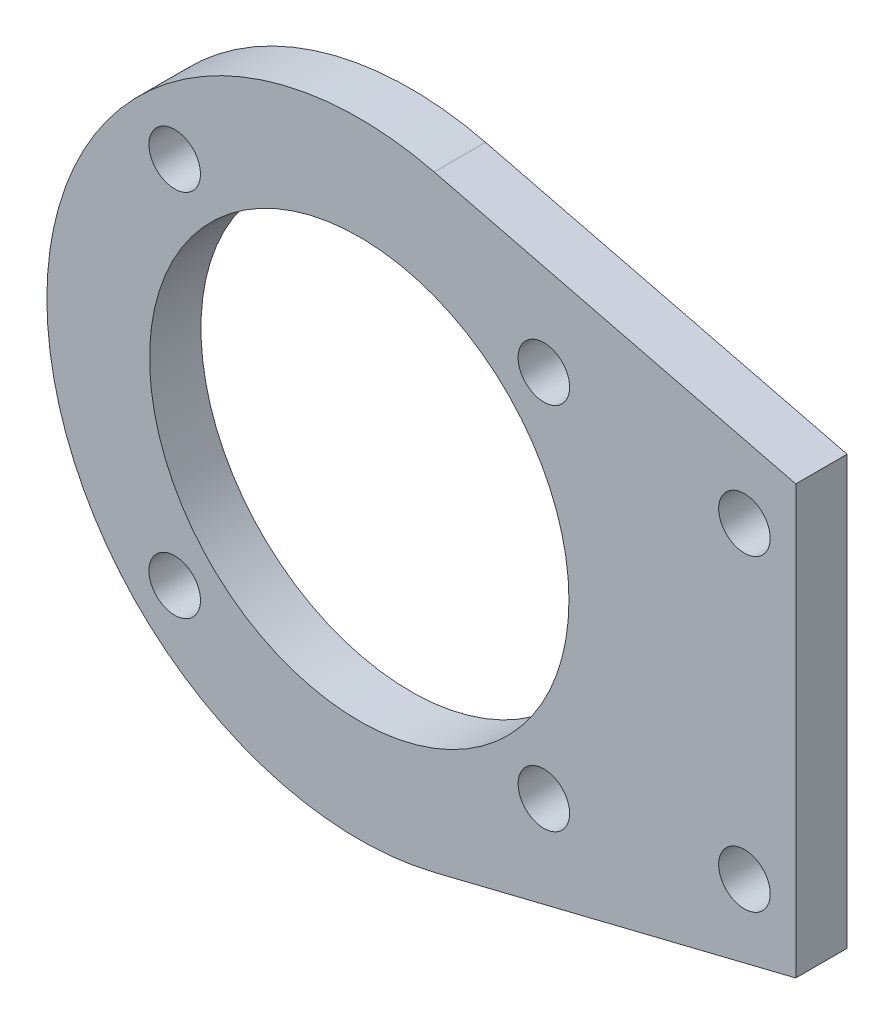
ISO-10303-21;
HEADER;
FILE_DESCRIPTION(('STEP AP214'),'2;1');
FILE_NAME('part.step','',(''),(''),'','','');
FILE_SCHEMA(('AUTOMOTIVE_DESIGN { 1 0 10303 214 1 1 1 1 }'));
ENDSEC;
DATA;
#1=APPLICATION_CONTEXT('core data for automotive mechanical design processes');
#2=APPLICATION_PROTOCOL_DEFINITION('international standard','automotive_design',2000,#1);
#3=PRODUCT_CONTEXT('',#1,'mechanical');
#4=PRODUCT('Part','Part','',(#3));
#5=PRODUCT_RELATED_PRODUCT_CATEGORY('part','',(#4));
#6=PRODUCT_DEFINITION_FORMATION('','',#4);
#7=PRODUCT_DEFINITION_CONTEXT('part definition',#1,'design');
#8=PRODUCT_DEFINITION('design','',#6,#7);
#9=PRODUCT_DEFINITION_SHAPE('','',#8);
#10=(LENGTH_UNIT() NAMED_UNIT(*) SI_UNIT(.MILLI.,.METRE.));
#11=(NAMED_UNIT(*) PLANE_ANGLE_UNIT() SI_UNIT($,.RADIAN.));
#12=(NAMED_UNIT(*) SI_UNIT($,.STERADIAN.) SOLID_ANGLE_UNIT());
#13=UNCERTAINTY_MEASURE_WITH_UNIT(LENGTH_MEASURE(1.E-05),#10,'distance_accuracy_value','');
#14=(GEOMETRIC_REPRESENTATION_CONTEXT(3) GLOBAL_UNCERTAINTY_ASSIGNED_CONTEXT((#13)) GLOBAL_UNIT_ASSIGNED_CONTEXT((#10,
#11,#12)) REPRESENTATION_CONTEXT('',''));
#15=CARTESIAN_POINT('',(0.,0.,0.));
#16=DIRECTION('',(0.,0.,1.));
#17=DIRECTION('',(1.,0.,0.));
#18=AXIS2_PLACEMENT_3D('',#15,#16,#17);
#19=CARTESIAN_POINT('',(0.,0.,3.));
#20=DIRECTION('',(0.,0.,1.));
#21=DIRECTION('',(1.,0.,0.));
#22=AXIS2_PLACEMENT_3D('',#19,#20,#21);
#23=PLANE('',#22);
#24=CARTESIAN_POINT('',(22.5,-9.,3.));
#25=DIRECTION('',(0.,0.,1.));
#26=DIRECTION('',(1.,0.,0.));
#27=AXIS2_PLACEMENT_3D('',#24,#25,#26);
#28=CIRCLE('',#27,1.505);
#29=CARTESIAN_POINT('',(24.005,-9.,3.));
#30=VERTEX_POINT('',#29);
#31=EDGE_CURVE('E139',#30,#30,#28,.T.);
#32=ORIENTED_EDGE('',*,*,#31,.F.);
#33=EDGE_LOOP('',(#32));
#34=FACE_BOUND('',#33,.T.);
#35=CARTESIAN_POINT('',(22.5,9.,3.));
#36=DIRECTION('',(0.,0.,1.));
#37=DIRECTION('',(1.,0.,0.));
#38=AXIS2_PLACEMENT_3D('',#35,#36,#37);
#39=CIRCLE('',#38,1.505);
#40=CARTESIAN_POINT('',(24.005,9.,3.));
#41=VERTEX_POINT('',#40);
#42=EDGE_CURVE('E146',#41,#41,#39,.T.);
#43=ORIENTED_EDGE('',*,*,#42,.F.);
#44=EDGE_LOOP('',(#43));
#45=FACE_BOUND('',#44,.T.);
#46=CARTESIAN_POINT('',(-10.7833784130948,-10.7833784130949,3.));
#47=DIRECTION('',(0.,0.,1.));
#48=DIRECTION('',(1.,0.,0.));
#49=AXIS2_PLACEMENT_3D('',#46,#47,#48);
#50=CIRCLE('',#49,1.505);
#51=CARTESIAN_POINT('',(-9.27837841309479,-10.7833784130949,3.));
#52=VERTEX_POINT('',#51);
#53=EDGE_CURVE('E135',#52,#52,#50,.T.);
#54=ORIENTED_EDGE('',*,*,#53,.F.);
#55=EDGE_LOOP('',(#54));
#56=FACE_BOUND('',#55,.T.);
#57=CARTESIAN_POINT('',(10.7833784130949,-10.7833784130948,3.));
#58=DIRECTION('',(0.,0.,1.));
#59=DIRECTION('',(1.,0.,0.));
#60=AXIS2_PLACEMENT_3D('',#57,#58,#59);
#61=CIRCLE('',#60,1.505);
#62=CARTESIAN_POINT('',(12.2883784130949,-10.7833784130948,3.));
#63=VERTEX_POINT('',#62);
#64=EDGE_CURVE('E138',#63,#63,#61,.T.);
#65=ORIENTED_EDGE('',*,*,#64,.F.);
#66=EDGE_LOOP('',(#65));
#67=FACE_BOUND('',#66,.T.);
#68=CARTESIAN_POINT('',(10.7833784130948,10.7833784130949,3.));
#69=DIRECTION('',(0.,0.,1.));
#70=DIRECTION('',(1.,0.,0.));
#71=AXIS2_PLACEMENT_3D('',#68,#69,#70);
#72=CIRCLE('',#71,1.505);
#73=CARTESIAN_POINT('',(12.2883784130948,10.7833784130949,3.));
#74=VERTEX_POINT('',#73);
#75=EDGE_CURVE('E134',#74,#74,#72,.T.);
#76=ORIENTED_EDGE('',*,*,#75,.F.);
#77=EDGE_LOOP('',(#76));
#78=FACE_BOUND('',#77,.T.);
#79=CARTESIAN_POINT('',(-10.7833784130949,10.7833784130948,3.));
#80=DIRECTION('',(0.,0.,1.));
#81=DIRECTION('',(1.,0.,0.));
#82=AXIS2_PLACEMENT_3D('',#79,#80,#81);
#83=CIRCLE('',#82,1.505);
#84=CARTESIAN_POINT('',(-9.27837841309491,10.7833784130948,3.));
#85=VERTEX_POINT('',#84);
#86=EDGE_CURVE('E115',#85,#85,#83,.T.);
#87=ORIENTED_EDGE('',*,*,#86,.F.);
#88=EDGE_LOOP('',(#87));
#89=FACE_BOUND('',#88,.T.);
#90=DIRECTION('',(-0.970824282751077,0.239792018259276,0.));
#91=VECTOR('',#90,1.);
#92=CARTESIAN_POINT('',(25.5,12.5,3.));
#93=LINE('',#92,#91);
#94=CARTESIAN_POINT('',(25.5,12.5,3.));
#95=VERTEX_POINT('',#94);
#96=CARTESIAN_POINT('',(4.37620433323179,17.7175431602072,3.));
#97=VERTEX_POINT('',#96);
#98=EDGE_CURVE('E89',#95,#97,#93,.T.);
#99=ORIENTED_EDGE('',*,*,#98,.T.);
#100=CARTESIAN_POINT('',(0.,0.,3.));
#101=DIRECTION('',(0.,0.,1.));
#102=DIRECTION('',(1.,0.,0.));
#103=AXIS2_PLACEMENT_3D('',#100,#101,#102);
#104=CIRCLE('',#103,18.25);
#105=CARTESIAN_POINT('',(4.37620433323178,-17.7175431602072,3.));
#106=VERTEX_POINT('',#105);
#107=EDGE_CURVE('E84',#97,#106,#104,.T.);
#108=ORIENTED_EDGE('',*,*,#107,.T.);
#109=DIRECTION('',(0.970824282751077,0.239792018259276,0.));
#110=VECTOR('',#109,1.);
#111=CARTESIAN_POINT('',(25.5,-12.5,3.));
#112=LINE('',#111,#110);
#113=CARTESIAN_POINT('',(25.5,-12.5,3.));
#114=VERTEX_POINT('',#113);
#115=EDGE_CURVE('E87',#106,#114,#112,.T.);
#116=ORIENTED_EDGE('',*,*,#115,.T.);
#117=DIRECTION('',(0.,1.,0.));
#118=VECTOR('',#117,1.);
#119=CARTESIAN_POINT('',(25.5,12.5,3.));
#120=LINE('',#119,#118);
#121=EDGE_CURVE('E54',#114,#95,#120,.T.);
#122=ORIENTED_EDGE('',*,*,#121,.T.);
#123=EDGE_LOOP('',(#99,#108,#116,#122));
#124=FACE_BOUND('',#123,.T.);
#125=CARTESIAN_POINT('',(0.,0.,3.));
#126=DIRECTION('',(0.,0.,1.));
#127=DIRECTION('',(1.,0.,0.));
#128=AXIS2_PLACEMENT_3D('',#125,#126,#127);
#129=CIRCLE('',#128,12.25);
#130=CARTESIAN_POINT('',(12.25,0.,3.));
#131=VERTEX_POINT('',#130);
#132=EDGE_CURVE('E105',#131,#131,#129,.T.);
#133=ORIENTED_EDGE('',*,*,#132,.F.);
#134=EDGE_LOOP('',(#133));
#135=FACE_BOUND('',#134,.T.);
#136=ADVANCED_FACE('F35',(#34,#45,#56,#67,#78,#89,#124,#135),#23,.T.);
#137=CARTESIAN_POINT('',(0.,0.,0.));
#138=DIRECTION('',(0.,0.,1.));
#139=DIRECTION('',(1.,0.,0.));
#140=AXIS2_PLACEMENT_3D('',#137,#138,#139);
#141=PLANE('',#140);
#142=CARTESIAN_POINT('',(22.5,-9.,0.));
#143=DIRECTION('',(0.,0.,1.));
#144=DIRECTION('',(1.,0.,0.));
#145=AXIS2_PLACEMENT_3D('',#142,#143,#144);
#146=CIRCLE('',#145,1.505);
#147=CARTESIAN_POINT('',(24.005,-9.,0.));
#148=VERTEX_POINT('',#147);
#149=EDGE_CURVE('E149',#148,#148,#146,.T.);
#150=ORIENTED_EDGE('',*,*,#149,.T.);
#151=EDGE_LOOP('',(#150));
#152=FACE_BOUND('',#151,.T.);
#153=CARTESIAN_POINT('',(22.5,9.,0.));
#154=DIRECTION('',(0.,0.,1.));
#155=DIRECTION('',(1.,0.,0.));
#156=AXIS2_PLACEMENT_3D('',#153,#154,#155);
#157=CIRCLE('',#156,1.505);
#158=CARTESIAN_POINT('',(24.005,9.,0.));
#159=VERTEX_POINT('',#158);
#160=EDGE_CURVE('E150',#159,#159,#157,.T.);
#161=ORIENTED_EDGE('',*,*,#160,.T.);
#162=EDGE_LOOP('',(#161));
#163=FACE_BOUND('',#162,.T.);
#164=CARTESIAN_POINT('',(-10.7833784130948,-10.7833784130949,0.));
#165=DIRECTION('',(0.,0.,1.));
#166=DIRECTION('',(1.,0.,0.));
#167=AXIS2_PLACEMENT_3D('',#164,#165,#166);
#168=CIRCLE('',#167,1.505);
#169=CARTESIAN_POINT('',(-9.27837841309479,-10.7833784130949,0.));
#170=VERTEX_POINT('',#169);
#171=EDGE_CURVE('E39',#170,#170,#168,.T.);
#172=ORIENTED_EDGE('',*,*,#171,.T.);
#173=EDGE_LOOP('',(#172));
#174=FACE_BOUND('',#173,.T.);
#175=CARTESIAN_POINT('',(10.7833784130949,-10.7833784130948,0.));
#176=DIRECTION('',(0.,0.,1.));
#177=DIRECTION('',(1.,0.,0.));
#178=AXIS2_PLACEMENT_3D('',#175,#176,#177);
#179=CIRCLE('',#178,1.505);
#180=CARTESIAN_POINT('',(12.2883784130949,-10.7833784130948,0.));
#181=VERTEX_POINT('',#180);
#182=EDGE_CURVE('E117',#181,#181,#179,.T.);
#183=ORIENTED_EDGE('',*,*,#182,.T.);
#184=EDGE_LOOP('',(#183));
#185=FACE_BOUND('',#184,.T.);
#186=CARTESIAN_POINT('',(10.7833784130948,10.7833784130949,0.));
#187=DIRECTION('',(0.,0.,1.));
#188=DIRECTION('',(1.,0.,0.));
#189=AXIS2_PLACEMENT_3D('',#186,#187,#188);
#190=CIRCLE('',#189,1.505);
#191=CARTESIAN_POINT('',(12.2883784130948,10.7833784130949,0.));
#192=VERTEX_POINT('',#191);
#193=EDGE_CURVE('E114',#192,#192,#190,.T.);
#194=ORIENTED_EDGE('',*,*,#193,.T.);
#195=EDGE_LOOP('',(#194));
#196=FACE_BOUND('',#195,.T.);
#197=CARTESIAN_POINT('',(-10.7833784130949,10.7833784130948,0.));
#198=DIRECTION('',(0.,0.,1.));
#199=DIRECTION('',(1.,0.,0.));
#200=AXIS2_PLACEMENT_3D('',#197,#198,#199);
#201=CIRCLE('',#200,1.505);
#202=CARTESIAN_POINT('',(-9.27837841309491,10.7833784130948,0.));
#203=VERTEX_POINT('',#202);
#204=EDGE_CURVE('E111',#203,#203,#201,.T.);
#205=ORIENTED_EDGE('',*,*,#204,.T.);
#206=EDGE_LOOP('',(#205));
#207=FACE_BOUND('',#206,.T.);
#208=DIRECTION('',(-0.970824282751077,0.239792018259276,0.));
#209=VECTOR('',#208,1.);
#210=CARTESIAN_POINT('',(25.5,12.5,0.));
#211=LINE('',#210,#209);
#212=CARTESIAN_POINT('',(25.5,12.5,0.));
#213=VERTEX_POINT('',#212);
#214=CARTESIAN_POINT('',(4.37620433323179,17.7175431602072,0.));
#215=VERTEX_POINT('',#214);
#216=EDGE_CURVE('E102',#213,#215,#211,.T.);
#217=ORIENTED_EDGE('',*,*,#216,.F.);
#218=DIRECTION('',(0.,1.,0.));
#219=VECTOR('',#218,1.);
#220=CARTESIAN_POINT('',(25.5,12.5,0.));
#221=LINE('',#220,#219);
#222=CARTESIAN_POINT('',(25.5,-12.5,0.));
#223=VERTEX_POINT('',#222);
#224=EDGE_CURVE('E77',#223,#213,#221,.T.);
#225=ORIENTED_EDGE('',*,*,#224,.F.);
#226=DIRECTION('',(0.970824282751077,0.239792018259276,0.));
#227=VECTOR('',#226,1.);
#228=CARTESIAN_POINT('',(25.5,-12.5,0.));
#229=LINE('',#228,#227);
#230=CARTESIAN_POINT('',(4.37620433323178,-17.7175431602072,0.));
#231=VERTEX_POINT('',#230);
#232=EDGE_CURVE('E71',#231,#223,#229,.T.);
#233=ORIENTED_EDGE('',*,*,#232,.F.);
#234=CARTESIAN_POINT('',(0.,0.,0.));
#235=DIRECTION('',(0.,0.,1.));
#236=DIRECTION('',(1.,0.,0.));
#237=AXIS2_PLACEMENT_3D('',#234,#235,#236);
#238=CIRCLE('',#237,18.25);
#239=EDGE_CURVE('E93',#215,#231,#238,.T.);
#240=ORIENTED_EDGE('',*,*,#239,.F.);
#241=EDGE_LOOP('',(#217,#225,#233,#240));
#242=FACE_BOUND('',#241,.T.);
#243=CARTESIAN_POINT('',(0.,0.,0.));
#244=DIRECTION('',(0.,0.,1.));
#245=DIRECTION('',(1.,0.,0.));
#246=AXIS2_PLACEMENT_3D('',#243,#244,#245);
#247=CIRCLE('',#246,12.25);
#248=CARTESIAN_POINT('',(12.25,0.,0.));
#249=VERTEX_POINT('',#248);
#250=EDGE_CURVE('E122',#249,#249,#247,.T.);
#251=ORIENTED_EDGE('',*,*,#250,.T.);
#252=EDGE_LOOP('',(#251));
#253=FACE_BOUND('',#252,.T.);
#254=ADVANCED_FACE('F156',(#152,#163,#174,#185,#196,#207,#242,#253),#141,.F.);
#255=CARTESIAN_POINT('',(25.5,12.5,3.));
#256=DIRECTION('',(-0.239792018259276,-0.970824282751077,0.));
#257=DIRECTION('',(0.970824282751077,-0.239792018259276,0.));
#258=AXIS2_PLACEMENT_3D('',#255,#256,#257);
#259=PLANE('',#258);
#260=ORIENTED_EDGE('',*,*,#216,.T.);
#261=DIRECTION('',(0.,0.,-1.));
#262=VECTOR('',#261,1.);
#263=CARTESIAN_POINT('',(4.37620433323179,17.7175431602072,3.));
#264=LINE('',#263,#262);
#265=EDGE_CURVE('E11',#97,#215,#264,.T.);
#266=ORIENTED_EDGE('',*,*,#265,.F.);
#267=ORIENTED_EDGE('',*,*,#98,.F.);
#268=DIRECTION('',(0.,0.,-1.));
#269=VECTOR('',#268,1.);
#270=CARTESIAN_POINT('',(25.5,12.5,3.));
#271=LINE('',#270,#269);
#272=EDGE_CURVE('E98',#95,#213,#271,.T.);
#273=ORIENTED_EDGE('',*,*,#272,.T.);
#274=EDGE_LOOP('',(#260,#266,#267,#273));
#275=FACE_BOUND('',#274,.T.);
#276=ADVANCED_FACE('F37',(#275),#259,.F.);
#277=CARTESIAN_POINT('',(0.,0.,3.));
#278=DIRECTION('',(0.,0.,-1.));
#279=DIRECTION('',(-1.,0.,0.));
#280=AXIS2_PLACEMENT_3D('',#277,#278,#279);
#281=CYLINDRICAL_SURFACE('',#280,18.25);
#282=ORIENTED_EDGE('',*,*,#239,.T.);
#283=DIRECTION('',(0.,0.,-1.));
#284=VECTOR('',#283,1.);
#285=CARTESIAN_POINT('',(4.37620433323178,-17.7175431602072,3.));
#286=LINE('',#285,#284);
#287=EDGE_CURVE('E45',#106,#231,#286,.T.);
#288=ORIENTED_EDGE('',*,*,#287,.F.);
#289=ORIENTED_EDGE('',*,*,#107,.F.);
#290=ORIENTED_EDGE('',*,*,#265,.T.);
#291=EDGE_LOOP('',(#282,#288,#289,#290));
#292=FACE_BOUND('',#291,.T.);
#293=ADVANCED_FACE('F92',(#292),#281,.T.);
#294=CARTESIAN_POINT('',(25.5,-12.5,3.));
#295=DIRECTION('',(-0.239792018259276,0.970824282751077,0.));
#296=DIRECTION('',(-0.970824282751077,-0.239792018259276,0.));
#297=AXIS2_PLACEMENT_3D('',#294,#295,#296);
#298=PLANE('',#297);
#299=ORIENTED_EDGE('',*,*,#232,.T.);
#300=DIRECTION('',(0.,0.,-1.));
#301=VECTOR('',#300,1.);
#302=CARTESIAN_POINT('',(25.5,-12.5,3.));
#303=LINE('',#302,#301);
#304=EDGE_CURVE('E94',#114,#223,#303,.T.);
#305=ORIENTED_EDGE('',*,*,#304,.F.);
#306=ORIENTED_EDGE('',*,*,#115,.F.);
#307=ORIENTED_EDGE('',*,*,#287,.T.);
#308=EDGE_LOOP('',(#299,#305,#306,#307));
#309=FACE_BOUND('',#308,.T.);
#310=ADVANCED_FACE('F96',(#309),#298,.F.);
#311=CARTESIAN_POINT('',(25.5,12.5,3.));
#312=DIRECTION('',(-1.,0.,0.));
#313=DIRECTION('',(0.,0.,1.));
#314=AXIS2_PLACEMENT_3D('',#311,#312,#313);
#315=PLANE('',#314);
#316=ORIENTED_EDGE('',*,*,#224,.T.);
#317=ORIENTED_EDGE('',*,*,#272,.F.);
#318=ORIENTED_EDGE('',*,*,#121,.F.);
#319=ORIENTED_EDGE('',*,*,#304,.T.);
#320=EDGE_LOOP('',(#316,#317,#318,#319));
#321=FACE_BOUND('',#320,.T.);
#322=ADVANCED_FACE('F184',(#321),#315,.F.);
#323=CARTESIAN_POINT('',(0.,0.,3.));
#324=DIRECTION('',(0.,0.,-1.));
#325=DIRECTION('',(-1.,0.,0.));
#326=AXIS2_PLACEMENT_3D('',#323,#324,#325);
#327=CYLINDRICAL_SURFACE('',#326,12.25);
#328=ORIENTED_EDGE('',*,*,#132,.T.);
#329=EDGE_LOOP('',(#328));
#330=FACE_BOUND('',#329,.T.);
#331=ORIENTED_EDGE('',*,*,#250,.F.);
#332=EDGE_LOOP('',(#331));
#333=FACE_BOUND('',#332,.T.);
#334=ADVANCED_FACE('F181',(#330,#333),#327,.F.);
#335=CARTESIAN_POINT('',(-10.7833784130949,10.7833784130948,-29.));
#336=DIRECTION('',(0.,0.,1.));
#337=DIRECTION('',(1.,0.,0.));
#338=AXIS2_PLACEMENT_3D('',#335,#336,#337);
#339=CYLINDRICAL_SURFACE('',#338,1.505);
#340=ORIENTED_EDGE('',*,*,#86,.T.);
#341=EDGE_LOOP('',(#340));
#342=FACE_BOUND('',#341,.T.);
#343=ORIENTED_EDGE('',*,*,#204,.F.);
#344=EDGE_LOOP('',(#343));
#345=FACE_BOUND('',#344,.T.);
#346=ADVANCED_FACE('F238',(#342,#345),#339,.F.);
#347=CARTESIAN_POINT('',(10.7833784130948,10.7833784130949,-29.));
#348=DIRECTION('',(0.,0.,1.));
#349=DIRECTION('',(1.,0.,0.));
#350=AXIS2_PLACEMENT_3D('',#347,#348,#349);
#351=CYLINDRICAL_SURFACE('',#350,1.505);
#352=ORIENTED_EDGE('',*,*,#75,.T.);
#353=EDGE_LOOP('',(#352));
#354=FACE_BOUND('',#353,.T.);
#355=ORIENTED_EDGE('',*,*,#193,.F.);
#356=EDGE_LOOP('',(#355));
#357=FACE_BOUND('',#356,.T.);
#358=ADVANCED_FACE('F230',(#354,#357),#351,.F.);
#359=CARTESIAN_POINT('',(10.7833784130949,-10.7833784130948,-29.));
#360=DIRECTION('',(0.,0.,1.));
#361=DIRECTION('',(1.,0.,0.));
#362=AXIS2_PLACEMENT_3D('',#359,#360,#361);
#363=CYLINDRICAL_SURFACE('',#362,1.505);
#364=ORIENTED_EDGE('',*,*,#64,.T.);
#365=EDGE_LOOP('',(#364));
#366=FACE_BOUND('',#365,.T.);
#367=ORIENTED_EDGE('',*,*,#182,.F.);
#368=EDGE_LOOP('',(#367));
#369=FACE_BOUND('',#368,.T.);
#370=ADVANCED_FACE('F223',(#366,#369),#363,.F.);
#371=CARTESIAN_POINT('',(-10.7833784130948,-10.7833784130949,-29.));
#372=DIRECTION('',(0.,0.,1.));
#373=DIRECTION('',(1.,0.,0.));
#374=AXIS2_PLACEMENT_3D('',#371,#372,#373);
#375=CYLINDRICAL_SURFACE('',#374,1.505);
#376=ORIENTED_EDGE('',*,*,#53,.T.);
#377=EDGE_LOOP('',(#376));
#378=FACE_BOUND('',#377,.T.);
#379=ORIENTED_EDGE('',*,*,#171,.F.);
#380=EDGE_LOOP('',(#379));
#381=FACE_BOUND('',#380,.T.);
#382=ADVANCED_FACE('F167',(#378,#381),#375,.F.);
#383=CARTESIAN_POINT('',(22.5,9.,0.));
#384=DIRECTION('',(0.,0.,1.));
#385=DIRECTION('',(1.,0.,0.));
#386=AXIS2_PLACEMENT_3D('',#383,#384,#385);
#387=CYLINDRICAL_SURFACE('',#386,1.505);
#388=ORIENTED_EDGE('',*,*,#42,.T.);
#389=EDGE_LOOP('',(#388));
#390=FACE_BOUND('',#389,.T.);
#391=ORIENTED_EDGE('',*,*,#160,.F.);
#392=EDGE_LOOP('',(#391));
#393=FACE_BOUND('',#392,.T.);
#394=ADVANCED_FACE('F161',(#390,#393),#387,.F.);
#395=CARTESIAN_POINT('',(22.5,-9.,0.));
#396=DIRECTION('',(0.,0.,1.));
#397=DIRECTION('',(1.,0.,0.));
#398=AXIS2_PLACEMENT_3D('',#395,#396,#397);
#399=CYLINDRICAL_SURFACE('',#398,1.505);
#400=ORIENTED_EDGE('',*,*,#31,.T.);
#401=EDGE_LOOP('',(#400));
#402=FACE_BOUND('',#401,.T.);
#403=ORIENTED_EDGE('',*,*,#149,.F.);
#404=EDGE_LOOP('',(#403));
#405=FACE_BOUND('',#404,.T.);
#406=ADVANCED_FACE('F159',(#402,#405),#399,.F.);
#407=CLOSED_SHELL('',(#136,#254,#276,#293,#310,#322,#334,#346,#358,#370,#382,#394,#406));
#408=MANIFOLD_SOLID_BREP('B2',#407);
#409=ADVANCED_BREP_SHAPE_REPRESENTATION('',(#18,#408),#14);
#410=SHAPE_DEFINITION_REPRESENTATION(#9,#409);
ENDSEC;
END-ISO-10303-21;
